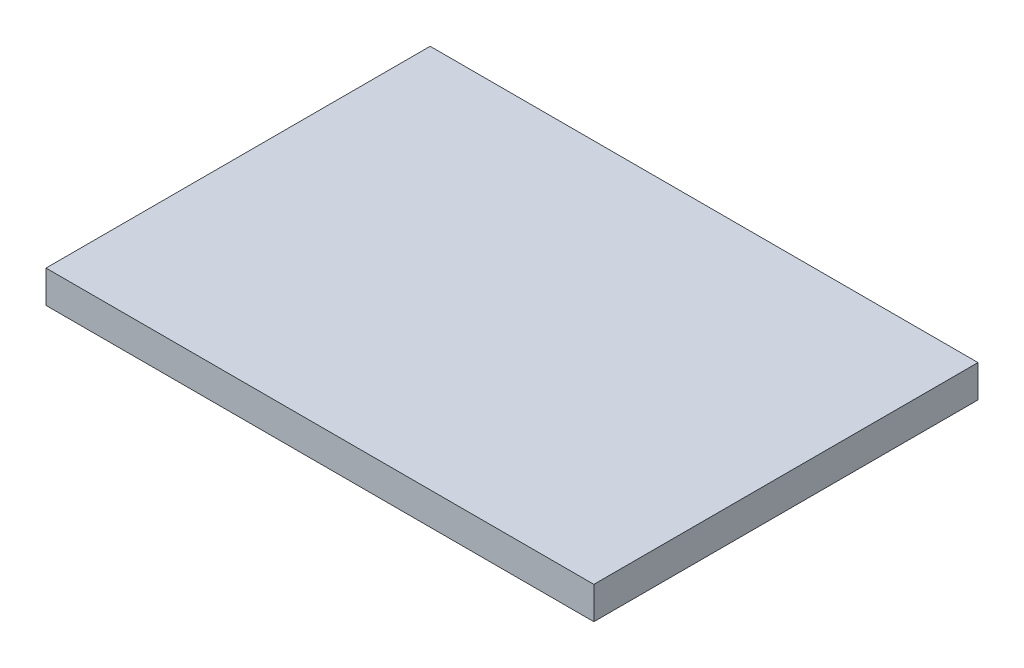
ISO-10303-21;
HEADER;
FILE_DESCRIPTION(('STEP AP214'),'2;1');
FILE_NAME('part.step','',(''),(''),'','','');
FILE_SCHEMA(('AUTOMOTIVE_DESIGN { 1 0 10303 214 1 1 1 1 }'));
ENDSEC;
DATA;
#1=APPLICATION_CONTEXT('core data for automotive mechanical design processes');
#2=APPLICATION_PROTOCOL_DEFINITION('international standard','automotive_design',2000,#1);
#3=PRODUCT_CONTEXT('',#1,'mechanical');
#4=PRODUCT('Part','Part','',(#3));
#5=PRODUCT_RELATED_PRODUCT_CATEGORY('part','',(#4));
#6=PRODUCT_DEFINITION_FORMATION('','',#4);
#7=PRODUCT_DEFINITION_CONTEXT('part definition',#1,'design');
#8=PRODUCT_DEFINITION('design','',#6,#7);
#9=PRODUCT_DEFINITION_SHAPE('','',#8);
#10=(LENGTH_UNIT() NAMED_UNIT(*) SI_UNIT(.MILLI.,.METRE.));
#11=(NAMED_UNIT(*) PLANE_ANGLE_UNIT() SI_UNIT($,.RADIAN.));
#12=(NAMED_UNIT(*) SI_UNIT($,.STERADIAN.) SOLID_ANGLE_UNIT());
#13=UNCERTAINTY_MEASURE_WITH_UNIT(LENGTH_MEASURE(1.E-05),#10,'distance_accuracy_value','');
#14=(GEOMETRIC_REPRESENTATION_CONTEXT(3) GLOBAL_UNCERTAINTY_ASSIGNED_CONTEXT((#13)) GLOBAL_UNIT_ASSIGNED_CONTEXT((#10,
#11,#12)) REPRESENTATION_CONTEXT('',''));
#15=CARTESIAN_POINT('',(0.,0.,0.));
#16=DIRECTION('',(0.,0.,1.));
#17=DIRECTION('',(1.,0.,0.));
#18=AXIS2_PLACEMENT_3D('',#15,#16,#17);
#19=CARTESIAN_POINT('',(0.,0.,0.));
#20=DIRECTION('',(0.,0.,-1.));
#21=DIRECTION('',(-1.,0.,0.));
#22=AXIS2_PLACEMENT_3D('',#19,#20,#21);
#23=PLANE('',#22);
#24=DIRECTION('',(1.,0.,0.));
#25=VECTOR('',#24,1.);
#26=CARTESIAN_POINT('',(-161.15,-33.1,0.));
#27=LINE('',#26,#25);
#28=CARTESIAN_POINT('',(-161.15,-33.1,0.));
#29=VERTEX_POINT('',#28);
#30=CARTESIAN_POINT('',(161.15,-33.1,0.));
#31=VERTEX_POINT('',#30);
#32=EDGE_CURVE('E83',#29,#31,#27,.T.);
#33=ORIENTED_EDGE('',*,*,#32,.F.);
#34=DIRECTION('',(0.,-1.,0.));
#35=VECTOR('',#34,1.);
#36=CARTESIAN_POINT('',(-161.15,-14.05,0.));
#37=LINE('',#36,#35);
#38=CARTESIAN_POINT('',(-161.15,-14.05,0.));
#39=VERTEX_POINT('',#38);
#40=EDGE_CURVE('E94',#39,#29,#37,.T.);
#41=ORIENTED_EDGE('',*,*,#40,.F.);
#42=DIRECTION('',(-1.,0.,0.));
#43=VECTOR('',#42,1.);
#44=CARTESIAN_POINT('',(-100.131670194949,-14.05,0.));
#45=LINE('',#44,#43);
#46=CARTESIAN_POINT('',(161.15,-14.05,0.));
#47=VERTEX_POINT('',#46);
#48=EDGE_CURVE('E85',#47,#39,#45,.T.);
#49=ORIENTED_EDGE('',*,*,#48,.F.);
#50=DIRECTION('',(0.,1.,0.));
#51=VECTOR('',#50,1.);
#52=CARTESIAN_POINT('',(161.15,-14.05,0.));
#53=LINE('',#52,#51);
#54=EDGE_CURVE('E75',#31,#47,#53,.T.);
#55=ORIENTED_EDGE('',*,*,#54,.F.);
#56=EDGE_LOOP('',(#33,#41,#49,#55));
#57=FACE_BOUND('',#56,.T.);
#58=ADVANCED_FACE('F33',(#57),#23,.T.);
#59=CARTESIAN_POINT('',(-161.15,-14.05,548.862497822215));
#60=DIRECTION('',(1.,0.,0.));
#61=DIRECTION('',(0.,0.,-1.));
#62=AXIS2_PLACEMENT_3D('',#59,#60,#61);
#63=PLANE('',#62);
#64=DIRECTION('',(0.,0.,-1.));
#65=VECTOR('',#64,1.);
#66=CARTESIAN_POINT('',(-161.15,-33.1,548.862497822215));
#67=LINE('',#66,#65);
#68=CARTESIAN_POINT('',(-161.15,-33.1,226.));
#69=VERTEX_POINT('',#68);
#70=EDGE_CURVE('E88',#69,#29,#67,.T.);
#71=ORIENTED_EDGE('',*,*,#70,.F.);
#72=DIRECTION('',(0.,1.,0.));
#73=VECTOR('',#72,1.);
#74=CARTESIAN_POINT('',(-161.15,-14.05,226.));
#75=LINE('',#74,#73);
#76=CARTESIAN_POINT('',(-161.15,-14.05,226.));
#77=VERTEX_POINT('',#76);
#78=EDGE_CURVE('E37',#69,#77,#75,.T.);
#79=ORIENTED_EDGE('',*,*,#78,.T.);
#80=DIRECTION('',(0.,0.,-1.));
#81=VECTOR('',#80,1.);
#82=CARTESIAN_POINT('',(-161.15,-14.05,548.862497822215));
#83=LINE('',#82,#81);
#84=EDGE_CURVE('E97',#77,#39,#83,.T.);
#85=ORIENTED_EDGE('',*,*,#84,.T.);
#86=ORIENTED_EDGE('',*,*,#40,.T.);
#87=EDGE_LOOP('',(#71,#79,#85,#86));
#88=FACE_BOUND('',#87,.T.);
#89=ADVANCED_FACE('F106',(#88),#63,.F.);
#90=CARTESIAN_POINT('',(-100.131670194949,-14.05,548.862497822215));
#91=DIRECTION('',(0.,-1.,0.));
#92=DIRECTION('',(1.,0.,0.));
#93=AXIS2_PLACEMENT_3D('',#90,#91,#92);
#94=PLANE('',#93);
#95=ORIENTED_EDGE('',*,*,#84,.F.);
#96=DIRECTION('',(1.,0.,0.));
#97=VECTOR('',#96,1.);
#98=CARTESIAN_POINT('',(-100.131670194949,-14.05,226.));
#99=LINE('',#98,#97);
#100=CARTESIAN_POINT('',(161.15,-14.0500000000001,226.));
#101=VERTEX_POINT('',#100);
#102=EDGE_CURVE('E103',#77,#101,#99,.T.);
#103=ORIENTED_EDGE('',*,*,#102,.T.);
#104=DIRECTION('',(0.,0.,-1.));
#105=VECTOR('',#104,1.);
#106=CARTESIAN_POINT('',(161.15,-14.05,548.862497822215));
#107=LINE('',#106,#105);
#108=EDGE_CURVE('E78',#101,#47,#107,.T.);
#109=ORIENTED_EDGE('',*,*,#108,.T.);
#110=ORIENTED_EDGE('',*,*,#48,.T.);
#111=EDGE_LOOP('',(#95,#103,#109,#110));
#112=FACE_BOUND('',#111,.T.);
#113=ADVANCED_FACE('F102',(#112),#94,.F.);
#114=CARTESIAN_POINT('',(161.15,-14.05,548.862497822215));
#115=DIRECTION('',(-1.,0.,0.));
#116=DIRECTION('',(0.,0.,1.));
#117=AXIS2_PLACEMENT_3D('',#114,#115,#116);
#118=PLANE('',#117);
#119=ORIENTED_EDGE('',*,*,#108,.F.);
#120=DIRECTION('',(0.,-1.,0.));
#121=VECTOR('',#120,1.);
#122=CARTESIAN_POINT('',(161.15,-14.05,226.));
#123=LINE('',#122,#121);
#124=CARTESIAN_POINT('',(161.15,-33.1,226.));
#125=VERTEX_POINT('',#124);
#126=EDGE_CURVE('E42',#101,#125,#123,.T.);
#127=ORIENTED_EDGE('',*,*,#126,.T.);
#128=DIRECTION('',(0.,0.,-1.));
#129=VECTOR('',#128,1.);
#130=CARTESIAN_POINT('',(161.15,-33.1,548.862497822215));
#131=LINE('',#130,#129);
#132=EDGE_CURVE('E72',#125,#31,#131,.T.);
#133=ORIENTED_EDGE('',*,*,#132,.T.);
#134=ORIENTED_EDGE('',*,*,#54,.T.);
#135=EDGE_LOOP('',(#119,#127,#133,#134));
#136=FACE_BOUND('',#135,.T.);
#137=ADVANCED_FACE('F74',(#136),#118,.F.);
#138=CARTESIAN_POINT('',(-161.15,-33.1,548.862497822215));
#139=DIRECTION('',(0.,1.,0.));
#140=DIRECTION('',(0.,0.,1.));
#141=AXIS2_PLACEMENT_3D('',#138,#139,#140);
#142=PLANE('',#141);
#143=ORIENTED_EDGE('',*,*,#132,.F.);
#144=DIRECTION('',(-1.,0.,0.));
#145=VECTOR('',#144,1.);
#146=CARTESIAN_POINT('',(-161.15,-33.1,226.));
#147=LINE('',#146,#145);
#148=EDGE_CURVE('E11',#125,#69,#147,.T.);
#149=ORIENTED_EDGE('',*,*,#148,.T.);
#150=ORIENTED_EDGE('',*,*,#70,.T.);
#151=ORIENTED_EDGE('',*,*,#32,.T.);
#152=EDGE_LOOP('',(#143,#149,#150,#151));
#153=FACE_BOUND('',#152,.T.);
#154=ADVANCED_FACE('F35',(#153),#142,.F.);
#155=CARTESIAN_POINT('',(0.,0.,226.));
#156=DIRECTION('',(0.,0.,-1.));
#157=DIRECTION('',(-1.,0.,0.));
#158=AXIS2_PLACEMENT_3D('',#155,#156,#157);
#159=PLANE('',#158);
#160=ORIENTED_EDGE('',*,*,#126,.F.);
#161=ORIENTED_EDGE('',*,*,#102,.F.);
#162=ORIENTED_EDGE('',*,*,#78,.F.);
#163=ORIENTED_EDGE('',*,*,#148,.F.);
#164=EDGE_LOOP('',(#160,#161,#162,#163));
#165=FACE_BOUND('',#164,.T.);
#166=ADVANCED_FACE('F120',(#165),#159,.F.);
#167=CLOSED_SHELL('',(#58,#89,#113,#137,#154,#166));
#168=MANIFOLD_SOLID_BREP('B2',#167);
#169=ADVANCED_BREP_SHAPE_REPRESENTATION('',(#18,#168),#14);
#170=SHAPE_DEFINITION_REPRESENTATION(#9,#169);
ENDSEC;
END-ISO-10303-21;
